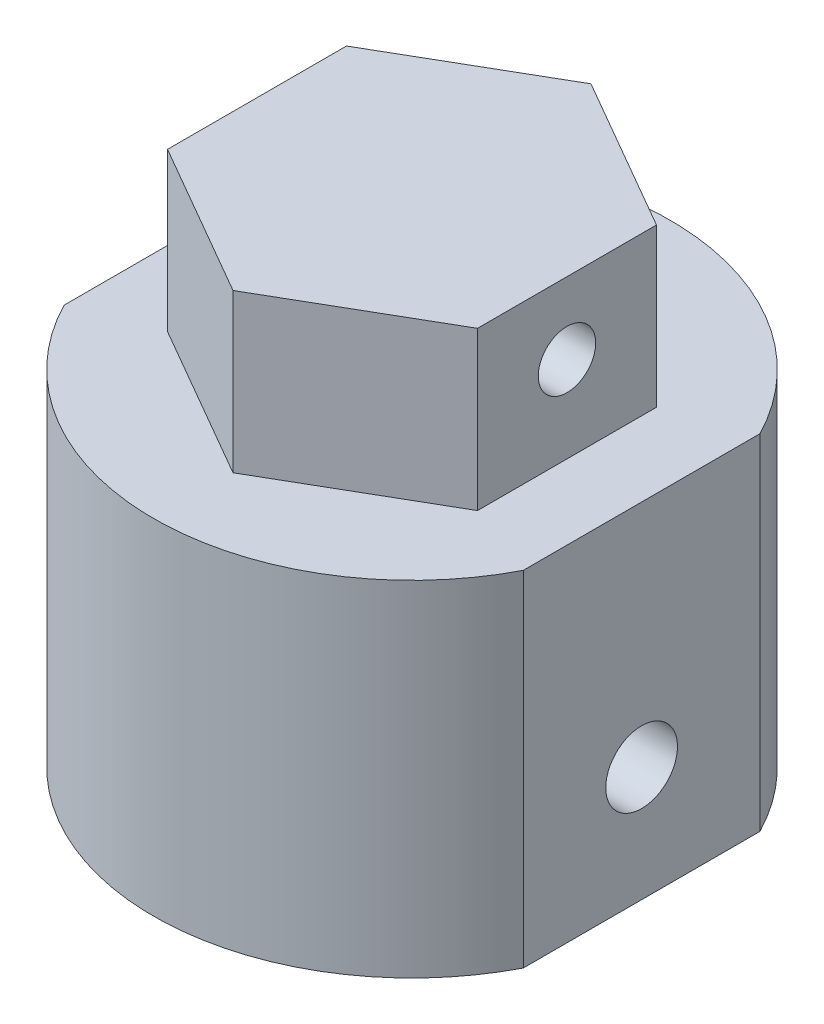
ISO-10303-21;
HEADER;
FILE_DESCRIPTION(('STEP AP214'),'2;1');
FILE_NAME('part.step','',(''),(''),'','','');
FILE_SCHEMA(('AUTOMOTIVE_DESIGN { 1 0 10303 214 1 1 1 1 }'));
ENDSEC;
DATA;
#1=APPLICATION_CONTEXT('core data for automotive mechanical design processes');
#2=APPLICATION_PROTOCOL_DEFINITION('international standard','automotive_design',2000,#1);
#3=PRODUCT_CONTEXT('',#1,'mechanical');
#4=PRODUCT('Part','Part','',(#3));
#5=PRODUCT_RELATED_PRODUCT_CATEGORY('part','',(#4));
#6=PRODUCT_DEFINITION_FORMATION('','',#4);
#7=PRODUCT_DEFINITION_CONTEXT('part definition',#1,'design');
#8=PRODUCT_DEFINITION('design','',#6,#7);
#9=PRODUCT_DEFINITION_SHAPE('','',#8);
#10=(LENGTH_UNIT() NAMED_UNIT(*) SI_UNIT(.MILLI.,.METRE.));
#11=(NAMED_UNIT(*) PLANE_ANGLE_UNIT() SI_UNIT($,.RADIAN.));
#12=(NAMED_UNIT(*) SI_UNIT($,.STERADIAN.) SOLID_ANGLE_UNIT());
#13=UNCERTAINTY_MEASURE_WITH_UNIT(LENGTH_MEASURE(1.E-05),#10,'distance_accuracy_value','');
#14=(GEOMETRIC_REPRESENTATION_CONTEXT(3) GLOBAL_UNCERTAINTY_ASSIGNED_CONTEXT((#13)) GLOBAL_UNIT_ASSIGNED_CONTEXT((#10,
#11,#12)) REPRESENTATION_CONTEXT('',''));
#15=CARTESIAN_POINT('',(0.,0.,0.));
#16=DIRECTION('',(0.,0.,1.));
#17=DIRECTION('',(1.,0.,0.));
#18=AXIS2_PLACEMENT_3D('',#15,#16,#17);
#19=CARTESIAN_POINT('',(0.,12.,0.));
#20=DIRECTION('',(0.,-1.,0.));
#21=DIRECTION('',(0.,0.,-1.));
#22=AXIS2_PLACEMENT_3D('',#19,#20,#21);
#23=CYLINDRICAL_SURFACE('',#22,9.);
#24=CARTESIAN_POINT('',(0.,12.,0.));
#25=DIRECTION('',(0.,1.,0.));
#26=DIRECTION('',(0.,0.,1.));
#27=AXIS2_PLACEMENT_3D('',#24,#25,#26);
#28=CIRCLE('',#27,9.);
#29=CARTESIAN_POINT('',(-8.00000000000001,12.,4.12310562561763));
#30=VERTEX_POINT('',#29);
#31=CARTESIAN_POINT('',(8.00000000000001,12.,4.12310562561763));
#32=VERTEX_POINT('',#31);
#33=EDGE_CURVE('E52',#30,#32,#28,.T.);
#34=ORIENTED_EDGE('',*,*,#33,.F.);
#35=DIRECTION('',(0.,-1.,0.));
#36=VECTOR('',#35,1.);
#37=CARTESIAN_POINT('',(-8.00000000000001,17.501,4.12310562561763));
#38=LINE('',#37,#36);
#39=CARTESIAN_POINT('',(-8.00000000000001,0.,4.12310562561763));
#40=VERTEX_POINT('',#39);
#41=EDGE_CURVE('E123',#30,#40,#38,.T.);
#42=ORIENTED_EDGE('',*,*,#41,.T.);
#43=CARTESIAN_POINT('',(0.,0.,0.));
#44=DIRECTION('',(0.,1.,0.));
#45=DIRECTION('',(0.,0.,1.));
#46=AXIS2_PLACEMENT_3D('',#43,#44,#45);
#47=CIRCLE('',#46,9.);
#48=CARTESIAN_POINT('',(8.00000000000001,0.,4.12310562561763));
#49=VERTEX_POINT('',#48);
#50=EDGE_CURVE('E236',#40,#49,#47,.T.);
#51=ORIENTED_EDGE('',*,*,#50,.T.);
#52=DIRECTION('',(0.,-1.,0.));
#53=VECTOR('',#52,1.);
#54=CARTESIAN_POINT('',(8.00000000000001,17.501,4.12310562561766));
#55=LINE('',#54,#53);
#56=EDGE_CURVE('E68',#32,#49,#55,.T.);
#57=ORIENTED_EDGE('',*,*,#56,.F.);
#58=EDGE_LOOP('',(#34,#42,#51,#57));
#59=FACE_BOUND('',#58,.T.);
#60=ADVANCED_FACE('F42',(#59),#23,.T.);
#61=CARTESIAN_POINT('',(8.00000000000001,0.,-4.12310562561767));
#62=VERTEX_POINT('',#61);
#63=CARTESIAN_POINT('',(-7.99999999999999,0.,-4.12310562561769));
#64=VERTEX_POINT('',#63);
#65=EDGE_CURVE('E135',#62,#64,#47,.T.);
#66=ORIENTED_EDGE('',*,*,#65,.T.);
#67=DIRECTION('',(0.,-1.,0.));
#68=VECTOR('',#67,1.);
#69=CARTESIAN_POINT('',(-7.99999999999999,17.501,-4.12310562561769));
#70=LINE('',#69,#68);
#71=CARTESIAN_POINT('',(-7.99999999999999,12.,-4.12310562561769));
#72=VERTEX_POINT('',#71);
#73=EDGE_CURVE('E60',#72,#64,#70,.T.);
#74=ORIENTED_EDGE('',*,*,#73,.F.);
#75=CARTESIAN_POINT('',(8.00000000000001,12.,-4.12310562561767));
#76=VERTEX_POINT('',#75);
#77=EDGE_CURVE('E11',#76,#72,#28,.T.);
#78=ORIENTED_EDGE('',*,*,#77,.F.);
#79=DIRECTION('',(0.,-1.,0.));
#80=VECTOR('',#79,1.);
#81=CARTESIAN_POINT('',(8.00000000000001,17.501,-4.12310562561767));
#82=LINE('',#81,#80);
#83=EDGE_CURVE('E144',#76,#62,#82,.T.);
#84=ORIENTED_EDGE('',*,*,#83,.T.);
#85=EDGE_LOOP('',(#66,#74,#78,#84));
#86=FACE_BOUND('',#85,.T.);
#87=ADVANCED_FACE('F44',(#86),#23,.T.);
#88=CARTESIAN_POINT('',(0.,12.,0.));
#89=DIRECTION('',(0.,1.,0.));
#90=DIRECTION('',(0.,0.,1.));
#91=AXIS2_PLACEMENT_3D('',#88,#89,#90);
#92=PLANE('',#91);
#93=DIRECTION('',(0.,0.,1.));
#94=VECTOR('',#93,1.);
#95=CARTESIAN_POINT('',(-7.99999999999999,12.,-4.12310562561769));
#96=LINE('',#95,#94);
#97=EDGE_CURVE('E120',#72,#30,#96,.T.);
#98=ORIENTED_EDGE('',*,*,#97,.T.);
#99=ORIENTED_EDGE('',*,*,#33,.T.);
#100=DIRECTION('',(0.,0.,-1.));
#101=VECTOR('',#100,1.);
#102=CARTESIAN_POINT('',(8.00000000000001,12.,-4.12310562561767));
#103=LINE('',#102,#101);
#104=EDGE_CURVE('E142',#32,#76,#103,.T.);
#105=ORIENTED_EDGE('',*,*,#104,.T.);
#106=ORIENTED_EDGE('',*,*,#77,.T.);
#107=EDGE_LOOP('',(#98,#99,#105,#106));
#108=FACE_BOUND('',#107,.T.);
#109=DIRECTION('',(-0.866025403784439,0.,-0.5));
#110=VECTOR('',#109,1.);
#111=CARTESIAN_POINT('',(5.4,12.,-3.11769145362398));
#112=LINE('',#111,#110);
#113=CARTESIAN_POINT('',(5.4,12.,-3.11769145362398));
#114=VERTEX_POINT('',#113);
#115=CARTESIAN_POINT('',(0.,12.,-6.23538290724796));
#116=VERTEX_POINT('',#115);
#117=EDGE_CURVE('E191',#114,#116,#112,.T.);
#118=ORIENTED_EDGE('',*,*,#117,.F.);
#119=DIRECTION('',(0.,0.,-1.));
#120=VECTOR('',#119,1.);
#121=CARTESIAN_POINT('',(5.4,12.,3.11769145362398));
#122=LINE('',#121,#120);
#123=CARTESIAN_POINT('',(5.4,12.,3.11769145362398));
#124=VERTEX_POINT('',#123);
#125=EDGE_CURVE('E175',#124,#114,#122,.T.);
#126=ORIENTED_EDGE('',*,*,#125,.F.);
#127=DIRECTION('',(0.866025403784439,0.,-0.5));
#128=VECTOR('',#127,1.);
#129=CARTESIAN_POINT('',(0.,12.,6.23538290724796));
#130=LINE('',#129,#128);
#131=CARTESIAN_POINT('',(0.,12.,6.23538290724796));
#132=VERTEX_POINT('',#131);
#133=EDGE_CURVE('E207',#132,#124,#130,.T.);
#134=ORIENTED_EDGE('',*,*,#133,.F.);
#135=DIRECTION('',(0.866025403784439,0.,0.5));
#136=VECTOR('',#135,1.);
#137=CARTESIAN_POINT('',(-5.4,12.,3.11769145362398));
#138=LINE('',#137,#136);
#139=CARTESIAN_POINT('',(-5.4,12.,3.11769145362398));
#140=VERTEX_POINT('',#139);
#141=EDGE_CURVE('E203',#140,#132,#138,.T.);
#142=ORIENTED_EDGE('',*,*,#141,.F.);
#143=DIRECTION('',(0.,0.,1.));
#144=VECTOR('',#143,1.);
#145=CARTESIAN_POINT('',(-5.4,12.,-3.11769145362398));
#146=LINE('',#145,#144);
#147=CARTESIAN_POINT('',(-5.4,12.,-3.11769145362398));
#148=VERTEX_POINT('',#147);
#149=EDGE_CURVE('E199',#148,#140,#146,.T.);
#150=ORIENTED_EDGE('',*,*,#149,.F.);
#151=DIRECTION('',(-0.866025403784439,0.,0.5));
#152=VECTOR('',#151,1.);
#153=CARTESIAN_POINT('',(0.,12.,-6.23538290724796));
#154=LINE('',#153,#152);
#155=EDGE_CURVE('E195',#116,#148,#154,.T.);
#156=ORIENTED_EDGE('',*,*,#155,.F.);
#157=EDGE_LOOP('',(#118,#126,#134,#142,#150,#156));
#158=FACE_BOUND('',#157,.T.);
#159=ADVANCED_FACE('F140',(#108,#158),#92,.T.);
#160=CARTESIAN_POINT('',(0.,0.,0.));
#161=DIRECTION('',(0.,1.,0.));
#162=DIRECTION('',(0.,0.,1.));
#163=AXIS2_PLACEMENT_3D('',#160,#161,#162);
#164=PLANE('',#163);
#165=CARTESIAN_POINT('',(0.,0.,0.));
#166=DIRECTION('',(0.,-1.,0.));
#167=DIRECTION('',(0.,0.,-1.));
#168=AXIS2_PLACEMENT_3D('',#165,#166,#167);
#169=CIRCLE('',#168,3.125);
#170=CARTESIAN_POINT('',(0.,0.,-3.125));
#171=VERTEX_POINT('',#170);
#172=EDGE_CURVE('E128',#171,#171,#169,.T.);
#173=ORIENTED_EDGE('',*,*,#172,.F.);
#174=EDGE_LOOP('',(#173));
#175=FACE_BOUND('',#174,.T.);
#176=ORIENTED_EDGE('',*,*,#50,.F.);
#177=DIRECTION('',(0.,0.,1.));
#178=VECTOR('',#177,1.);
#179=CARTESIAN_POINT('',(-7.99999999999999,0.,-4.12310562561769));
#180=LINE('',#179,#178);
#181=EDGE_CURVE('E137',#64,#40,#180,.T.);
#182=ORIENTED_EDGE('',*,*,#181,.F.);
#183=ORIENTED_EDGE('',*,*,#65,.F.);
#184=DIRECTION('',(0.,0.,-1.));
#185=VECTOR('',#184,1.);
#186=CARTESIAN_POINT('',(8.00000000000001,0.,-4.12310562561767));
#187=LINE('',#186,#185);
#188=EDGE_CURVE('E155',#49,#62,#187,.T.);
#189=ORIENTED_EDGE('',*,*,#188,.F.);
#190=EDGE_LOOP('',(#176,#182,#183,#189));
#191=FACE_BOUND('',#190,.T.);
#192=ADVANCED_FACE('F244',(#175,#191),#164,.F.);
#193=CARTESIAN_POINT('',(5.4,17.5,-3.11769145362398));
#194=DIRECTION('',(-0.5,0.,0.866025403784439));
#195=DIRECTION('',(0.866025403784439,0.,0.5));
#196=AXIS2_PLACEMENT_3D('',#193,#194,#195);
#197=PLANE('',#196);
#198=ORIENTED_EDGE('',*,*,#117,.T.);
#199=DIRECTION('',(0.,-1.,0.));
#200=VECTOR('',#199,1.);
#201=CARTESIAN_POINT('',(0.,17.5,-6.23538290724796));
#202=LINE('',#201,#200);
#203=CARTESIAN_POINT('',(0.,17.5,-6.23538290724796));
#204=VERTEX_POINT('',#203);
#205=EDGE_CURVE('E233',#204,#116,#202,.T.);
#206=ORIENTED_EDGE('',*,*,#205,.F.);
#207=DIRECTION('',(-0.866025403784439,0.,-0.5));
#208=VECTOR('',#207,1.);
#209=CARTESIAN_POINT('',(5.4,17.5,-3.11769145362398));
#210=LINE('',#209,#208);
#211=CARTESIAN_POINT('',(5.4,17.5,-3.11769145362398));
#212=VERTEX_POINT('',#211);
#213=EDGE_CURVE('E170',#212,#204,#210,.T.);
#214=ORIENTED_EDGE('',*,*,#213,.F.);
#215=DIRECTION('',(0.,-1.,0.));
#216=VECTOR('',#215,1.);
#217=CARTESIAN_POINT('',(5.4,17.5,-3.11769145362398));
#218=LINE('',#217,#216);
#219=EDGE_CURVE('E190',#212,#114,#218,.T.);
#220=ORIENTED_EDGE('',*,*,#219,.T.);
#221=EDGE_LOOP('',(#198,#206,#214,#220));
#222=FACE_BOUND('',#221,.T.);
#223=ADVANCED_FACE('F273',(#222),#197,.F.);
#224=CARTESIAN_POINT('',(0.,17.5,-6.23538290724796));
#225=DIRECTION('',(0.5,0.,0.866025403784439));
#226=DIRECTION('',(0.866025403784439,0.,-0.5));
#227=AXIS2_PLACEMENT_3D('',#224,#225,#226);
#228=PLANE('',#227);
#229=ORIENTED_EDGE('',*,*,#155,.T.);
#230=DIRECTION('',(0.,-1.,0.));
#231=VECTOR('',#230,1.);
#232=CARTESIAN_POINT('',(-5.4,17.5,-3.11769145362398));
#233=LINE('',#232,#231);
#234=CARTESIAN_POINT('',(-5.4,17.5,-3.11769145362398));
#235=VERTEX_POINT('',#234);
#236=EDGE_CURVE('E229',#235,#148,#233,.T.);
#237=ORIENTED_EDGE('',*,*,#236,.F.);
#238=DIRECTION('',(-0.866025403784439,0.,0.5));
#239=VECTOR('',#238,1.);
#240=CARTESIAN_POINT('',(0.,17.5,-6.23538290724796));
#241=LINE('',#240,#239);
#242=EDGE_CURVE('E174',#204,#235,#241,.T.);
#243=ORIENTED_EDGE('',*,*,#242,.F.);
#244=ORIENTED_EDGE('',*,*,#205,.T.);
#245=EDGE_LOOP('',(#229,#237,#243,#244));
#246=FACE_BOUND('',#245,.T.);
#247=ADVANCED_FACE('F278',(#246),#228,.F.);
#248=CARTESIAN_POINT('',(-5.4,17.5,-3.11769145362398));
#249=DIRECTION('',(1.,0.,0.));
#250=DIRECTION('',(0.,0.,-1.));
#251=AXIS2_PLACEMENT_3D('',#248,#249,#250);
#252=PLANE('',#251);
#253=CARTESIAN_POINT('',(-5.4,15.,0.));
#254=DIRECTION('',(-1.,0.,0.));
#255=DIRECTION('',(0.,0.,1.));
#256=AXIS2_PLACEMENT_3D('',#253,#254,#255);
#257=CIRCLE('',#256,1.);
#258=CARTESIAN_POINT('',(-5.4,15.,1.));
#259=VERTEX_POINT('',#258);
#260=EDGE_CURVE('E163',#259,#259,#257,.T.);
#261=ORIENTED_EDGE('',*,*,#260,.F.);
#262=EDGE_LOOP('',(#261));
#263=FACE_BOUND('',#262,.T.);
#264=ORIENTED_EDGE('',*,*,#149,.T.);
#265=DIRECTION('',(0.,-1.,0.));
#266=VECTOR('',#265,1.);
#267=CARTESIAN_POINT('',(-5.4,17.5,3.11769145362398));
#268=LINE('',#267,#266);
#269=CARTESIAN_POINT('',(-5.4,17.5,3.11769145362398));
#270=VERTEX_POINT('',#269);
#271=EDGE_CURVE('E225',#270,#140,#268,.T.);
#272=ORIENTED_EDGE('',*,*,#271,.F.);
#273=DIRECTION('',(0.,0.,1.));
#274=VECTOR('',#273,1.);
#275=CARTESIAN_POINT('',(-5.4,17.5,-3.11769145362398));
#276=LINE('',#275,#274);
#277=EDGE_CURVE('E178',#235,#270,#276,.T.);
#278=ORIENTED_EDGE('',*,*,#277,.F.);
#279=ORIENTED_EDGE('',*,*,#236,.T.);
#280=EDGE_LOOP('',(#264,#272,#278,#279));
#281=FACE_BOUND('',#280,.T.);
#282=ADVANCED_FACE('F282',(#263,#281),#252,.F.);
#283=CARTESIAN_POINT('',(-5.4,17.5,3.11769145362398));
#284=DIRECTION('',(0.5,0.,-0.866025403784439));
#285=DIRECTION('',(-0.866025403784439,0.,-0.5));
#286=AXIS2_PLACEMENT_3D('',#283,#284,#285);
#287=PLANE('',#286);
#288=ORIENTED_EDGE('',*,*,#141,.T.);
#289=DIRECTION('',(0.,-1.,0.));
#290=VECTOR('',#289,1.);
#291=CARTESIAN_POINT('',(0.,17.5,6.23538290724796));
#292=LINE('',#291,#290);
#293=CARTESIAN_POINT('',(0.,17.5,6.23538290724796));
#294=VERTEX_POINT('',#293);
#295=EDGE_CURVE('E221',#294,#132,#292,.T.);
#296=ORIENTED_EDGE('',*,*,#295,.F.);
#297=DIRECTION('',(0.866025403784439,0.,0.5));
#298=VECTOR('',#297,1.);
#299=CARTESIAN_POINT('',(-5.4,17.5,3.11769145362398));
#300=LINE('',#299,#298);
#301=EDGE_CURVE('E181',#270,#294,#300,.T.);
#302=ORIENTED_EDGE('',*,*,#301,.F.);
#303=ORIENTED_EDGE('',*,*,#271,.T.);
#304=EDGE_LOOP('',(#288,#296,#302,#303));
#305=FACE_BOUND('',#304,.T.);
#306=ADVANCED_FACE('F286',(#305),#287,.F.);
#307=CARTESIAN_POINT('',(0.,17.5,6.23538290724796));
#308=DIRECTION('',(-0.5,0.,-0.866025403784439));
#309=DIRECTION('',(-0.866025403784439,0.,0.5));
#310=AXIS2_PLACEMENT_3D('',#307,#308,#309);
#311=PLANE('',#310);
#312=ORIENTED_EDGE('',*,*,#133,.T.);
#313=DIRECTION('',(0.,-1.,0.));
#314=VECTOR('',#313,1.);
#315=CARTESIAN_POINT('',(5.4,17.5,3.11769145362398));
#316=LINE('',#315,#314);
#317=CARTESIAN_POINT('',(5.4,17.5,3.11769145362398));
#318=VERTEX_POINT('',#317);
#319=EDGE_CURVE('E217',#318,#124,#316,.T.);
#320=ORIENTED_EDGE('',*,*,#319,.F.);
#321=DIRECTION('',(0.866025403784439,0.,-0.5));
#322=VECTOR('',#321,1.);
#323=CARTESIAN_POINT('',(0.,17.5,6.23538290724796));
#324=LINE('',#323,#322);
#325=EDGE_CURVE('E184',#294,#318,#324,.T.);
#326=ORIENTED_EDGE('',*,*,#325,.F.);
#327=ORIENTED_EDGE('',*,*,#295,.T.);
#328=EDGE_LOOP('',(#312,#320,#326,#327));
#329=FACE_BOUND('',#328,.T.);
#330=ADVANCED_FACE('F290',(#329),#311,.F.);
#331=CARTESIAN_POINT('',(5.4,17.5,3.11769145362398));
#332=DIRECTION('',(-1.,0.,0.));
#333=DIRECTION('',(0.,0.,1.));
#334=AXIS2_PLACEMENT_3D('',#331,#332,#333);
#335=PLANE('',#334);
#336=CARTESIAN_POINT('',(5.4,15.,0.));
#337=DIRECTION('',(-1.,0.,0.));
#338=DIRECTION('',(0.,0.,1.));
#339=AXIS2_PLACEMENT_3D('',#336,#337,#338);
#340=CIRCLE('',#339,1.);
#341=CARTESIAN_POINT('',(5.4,15.,1.));
#342=VERTEX_POINT('',#341);
#343=EDGE_CURVE('E46',#342,#342,#340,.T.);
#344=ORIENTED_EDGE('',*,*,#343,.T.);
#345=EDGE_LOOP('',(#344));
#346=FACE_BOUND('',#345,.T.);
#347=ORIENTED_EDGE('',*,*,#125,.T.);
#348=ORIENTED_EDGE('',*,*,#219,.F.);
#349=DIRECTION('',(0.,0.,-1.));
#350=VECTOR('',#349,1.);
#351=CARTESIAN_POINT('',(5.4,17.5,3.11769145362398));
#352=LINE('',#351,#350);
#353=EDGE_CURVE('E187',#318,#212,#352,.T.);
#354=ORIENTED_EDGE('',*,*,#353,.F.);
#355=ORIENTED_EDGE('',*,*,#319,.T.);
#356=EDGE_LOOP('',(#347,#348,#354,#355));
#357=FACE_BOUND('',#356,.T.);
#358=ADVANCED_FACE('F294',(#346,#357),#335,.F.);
#359=CARTESIAN_POINT('',(0.,17.5,0.));
#360=DIRECTION('',(0.,1.,0.));
#361=DIRECTION('',(0.,0.,1.));
#362=AXIS2_PLACEMENT_3D('',#359,#360,#361);
#363=PLANE('',#362);
#364=ORIENTED_EDGE('',*,*,#213,.T.);
#365=ORIENTED_EDGE('',*,*,#242,.T.);
#366=ORIENTED_EDGE('',*,*,#277,.T.);
#367=ORIENTED_EDGE('',*,*,#301,.T.);
#368=ORIENTED_EDGE('',*,*,#325,.T.);
#369=ORIENTED_EDGE('',*,*,#353,.T.);
#370=EDGE_LOOP('',(#364,#365,#366,#367,#368,#369));
#371=FACE_BOUND('',#370,.T.);
#372=ADVANCED_FACE('F298',(#371),#363,.T.);
#373=CARTESIAN_POINT('',(9.,15.,0.));
#374=DIRECTION('',(-1.,0.,0.));
#375=DIRECTION('',(0.,0.,1.));
#376=AXIS2_PLACEMENT_3D('',#373,#374,#375);
#377=CYLINDRICAL_SURFACE('',#376,1.);
#378=ORIENTED_EDGE('',*,*,#260,.T.);
#379=EDGE_LOOP('',(#378));
#380=FACE_BOUND('',#379,.T.);
#381=ORIENTED_EDGE('',*,*,#343,.F.);
#382=EDGE_LOOP('',(#381));
#383=FACE_BOUND('',#382,.T.);
#384=ADVANCED_FACE('F302',(#380,#383),#377,.F.);
#385=CARTESIAN_POINT('',(0.,12.,0.));
#386=DIRECTION('',(0.,-1.,0.));
#387=DIRECTION('',(0.,0.,-1.));
#388=AXIS2_PLACEMENT_3D('',#385,#386,#387);
#389=CYLINDRICAL_SURFACE('',#388,3.125);
#390=CARTESIAN_POINT('',(2.8641098093474,4.,1.25000000000001));
#391=CARTESIAN_POINT('',(2.86411657285263,3.93303781368757,1.24999265887737));
#392=CARTESIAN_POINT('',(2.86649126552666,3.86598091580956,1.24458738662148));
#393=CARTESIAN_POINT('',(2.87569321367403,3.73379072945183,1.22316814412046));
#394=CARTESIAN_POINT('',(2.88253184616782,3.6686628018247,1.20712706527634));
#395=CARTESIAN_POINT('',(2.8997528486956,3.54246691126872,1.16514689535545));
#396=CARTESIAN_POINT('',(2.91012185223197,3.48138465789984,1.1392450953284));
#397=CARTESIAN_POINT('',(2.9332166568455,3.36444684321274,1.07838766835726));
#398=CARTESIAN_POINT('',(2.94594194314952,3.30859014428071,1.04343401829219));
#399=CARTESIAN_POINT('',(2.97313040656895,3.20046224859909,0.963326234117143));
#400=CARTESIAN_POINT('',(2.98764948724216,3.14852723566908,0.917737098579586));
#401=CARTESIAN_POINT('',(3.01632785611757,3.05279437667789,0.818568191108784));
#402=CARTESIAN_POINT('',(3.03048701710232,3.00899937419384,0.764985638547307));
#403=CARTESIAN_POINT('',(3.05752129941784,2.92912100188581,0.648753943972743));
#404=CARTESIAN_POINT('',(3.0703237730223,2.89340981158085,0.585830603507682));
#405=CARTESIAN_POINT('',(3.09252454769717,2.83322276975637,0.454265826796956));
#406=CARTESIAN_POINT('',(3.10192423365421,2.80874234638628,0.385626730804983));
#407=CARTESIAN_POINT('',(3.11586453130178,2.77291157097663,0.248104016774314));
#408=CARTESIAN_POINT('',(3.12061835484598,2.76098292869436,0.179393115502885));
#409=CARTESIAN_POINT('',(3.12550194176689,2.74873219646082,0.0407914553985389));
#410=CARTESIAN_POINT('',(3.12563342980821,2.74840577754072,-0.0290988536408698));
#411=CARTESIAN_POINT('',(3.12138726763616,2.75905173110937,-0.163895309197063));
#412=CARTESIAN_POINT('',(3.11726247982398,2.76939048296683,-0.228860908046264));
#413=CARTESIAN_POINT('',(3.10530807167994,2.79999554769422,-0.356045693261454));
#414=CARTESIAN_POINT('',(3.09747817950695,2.82026258900024,-0.418264677743842));
#415=CARTESIAN_POINT('',(3.07873015286062,2.87039780179769,-0.539311211569778));
#416=CARTESIAN_POINT('',(3.0677672529175,2.90040607175971,-0.598073514612264));
#417=CARTESIAN_POINT('',(3.04384115737311,2.96904062932438,-0.709880094212852));
#418=CARTESIAN_POINT('',(3.03087727665671,3.00766987068601,-0.762922401697561));
#419=CARTESIAN_POINT('',(3.00326023236459,3.09540570996662,-0.865480517495088));
#420=CARTESIAN_POINT('',(2.9885520407515,3.1450336828649,-0.91453615329602));
#421=CARTESIAN_POINT('',(2.95976038102987,3.2518691073881,-1.00381713461582));
#422=CARTESIAN_POINT('',(2.94567711860217,3.30907903009635,-1.04403958984978));
#423=CARTESIAN_POINT('',(2.91935560901133,3.4315118890056,-1.11556511796433));
#424=CARTESIAN_POINT('',(2.90718071363363,3.49691551905239,-1.14658415733431));
#425=CARTESIAN_POINT('',(2.88679744042078,3.63263468153876,-1.19698516247891));
#426=CARTESIAN_POINT('',(2.87858648702087,3.70294699048178,-1.21637468650274));
#427=CARTESIAN_POINT('',(2.86768599795353,3.84189736089753,-1.24184684301997));
#428=CARTESIAN_POINT('',(2.86468979030048,3.9103752794501,-1.24867006050525));
#429=CARTESIAN_POINT('',(2.86368436173187,4.04754825485497,-1.25097582903063));
#430=CARTESIAN_POINT('',(2.8656736285154,4.11624323954865,-1.24646181912055));
#431=CARTESIAN_POINT('',(2.87410027723208,4.2477868343468,-1.22689555924282));
#432=CARTESIAN_POINT('',(2.88027786123606,4.31074558587469,-1.21245816376465));
#433=CARTESIAN_POINT('',(2.8960628189242,4.43330525299126,-1.17425261681954));
#434=CARTESIAN_POINT('',(2.90567095305465,4.49290542069207,-1.15048239643899));
#435=CARTESIAN_POINT('',(2.92771113662469,4.60975147362218,-1.0932097746759));
#436=CARTESIAN_POINT('',(2.9402419039946,4.66680386793404,-1.05935179266536));
#437=CARTESIAN_POINT('',(2.96656490723649,4.77467686715104,-0.983228265276165));
#438=CARTESIAN_POINT('',(2.98035765560039,4.82549492049725,-0.940959295926232));
#439=CARTESIAN_POINT('',(3.00888072482123,4.92335838037451,-0.845527632300295));
#440=CARTESIAN_POINT('',(3.02360504553252,4.96984785330689,-0.79179089340318));
#441=CARTESIAN_POINT('',(3.05137371604727,5.05323567288146,-0.676927270855521));
#442=CARTESIAN_POINT('',(3.06441799745775,5.09013362912327,-0.615800086542408));
#443=CARTESIAN_POINT('',(3.08739822437679,5.15315476653827,-0.487674958751093));
#444=CARTESIAN_POINT('',(3.09733491400171,5.17928052760362,-0.420678425621283));
#445=CARTESIAN_POINT('',(3.11295445918306,5.21971803275477,-0.282745994324508));
#446=CARTESIAN_POINT('',(3.11863962317215,5.23403618840004,-0.211812256433911));
#447=CARTESIAN_POINT('',(3.1248688013157,5.24969043851587,-0.0730103189664318));
#448=CARTESIAN_POINT('',(3.12572404215546,5.25181258028916,-0.00524405787065191));
#449=CARTESIAN_POINT('',(3.1230377648662,5.24509032544743,0.129646147333285));
#450=CARTESIAN_POINT('',(3.1194969122932,5.23624758888399,0.196770187121646));
#451=CARTESIAN_POINT('',(3.10857195852659,5.20840825727595,0.326356813716514));
#452=CARTESIAN_POINT('',(3.10130925396457,5.18973190870278,0.388899252905248));
#453=CARTESIAN_POINT('',(3.08371842395023,5.14309199714886,0.509951471724345));
#454=CARTESIAN_POINT('',(3.07338973315007,5.11512672123728,0.568460505167055));
#455=CARTESIAN_POINT('',(3.05011308975036,5.04931050094416,0.682626901160079));
#456=CARTESIAN_POINT('',(3.03706956080144,5.01107731569682,0.738043991754023));
#457=CARTESIAN_POINT('',(3.00993376991529,4.92638217551317,0.841908767827552));
#458=CARTESIAN_POINT('',(2.99584107531563,4.87991681471243,0.890353553591104));
#459=CARTESIAN_POINT('',(2.96711102224639,4.77667798467184,0.982000790678752));
#460=CARTESIAN_POINT('',(2.95249395378364,4.71944445412431,1.0246930544994));
#461=CARTESIAN_POINT('',(2.92531044671987,4.59816116410702,1.09990465652463));
#462=CARTESIAN_POINT('',(2.91274424929659,4.53411060443134,1.1324227986875));
#463=CARTESIAN_POINT('',(2.89224290286192,4.40685174884495,1.18374442979583));
#464=CARTESIAN_POINT('',(2.8839932413228,4.34408422828051,1.20351719635264));
#465=CARTESIAN_POINT('',(2.87153752252477,4.21594661273104,1.2329485986365));
#466=CARTESIAN_POINT('',(2.86732020045109,4.15058430252065,1.24263541743002));
#467=CARTESIAN_POINT('',(2.86452786723521,4.05663902353879,1.24904016144386));
#468=CARTESIAN_POINT('',(2.86410694808348,4.0283279868765,1.25000310562181));
#469=CARTESIAN_POINT('',(2.8641098093474,4.,1.25000000000001));
#470=B_SPLINE_CURVE_WITH_KNOTS('',3,(#390,#391,#392,#393,#394,#395,#396,#397,#398,#399,#400,
#401,#402,#403,#404,#405,#406,#407,#408,#409,#410,#411,#412,#413,#414,#415,#416,#417,#418,#419,
#420,#421,#422,#423,#424,#425,#426,#427,#428,#429,#430,#431,#432,#433,#434,#435,#436,#437,#438,
#439,#440,#441,#442,#443,#444,#445,#446,#447,#448,#449,#450,#451,#452,#453,#454,#455,#456,#457,
#458,#459,#460,#461,#462,#463,#464,#465,#466,#467,#468,#469),.UNSPECIFIED.,.T.,.F.,(4,2,2,2,2,2,
2,2,2,2,2,2,2,2,2,2,2,2,2,2,2,2,2,2,2,2,2,2,2,2,2,2,2,2,2,2,2,2,2,4),(0.,0.200798530479784,
0.402110834888904,0.602669264558369,0.803183930149135,1.01409761427765,1.22508483967714,
1.44439168182143,1.66360916855925,1.8722136430449,2.08074028316045,2.27755403018939,
2.47438221955662,2.67417687646811,2.87404009337519,3.08702527550847,3.30008004454454,
3.5191528669661,3.7380831549632,3.94363842199019,4.14913134313718,4.34292030049472,
4.5367522415353,4.73844471654194,4.94021946574912,5.15689833900618,5.37358603029224,
5.59022179566764,5.80673984967591,6.00913149843727,6.21149250941632,6.40763746523351,
6.60381861139122,6.80866906958709,7.01360447848885,7.23122658299765,7.44887426095749,
7.64697913008179,7.84452893883284,7.92947565950458),.UNSPECIFIED.);
#471=CARTESIAN_POINT('',(2.8641098093474,4.,1.25000000000001));
#472=VERTEX_POINT('',#471);
#473=EDGE_CURVE('E145',#472,#472,#470,.T.);
#474=ORIENTED_EDGE('',*,*,#473,.T.);
#475=EDGE_LOOP('',(#474));
#476=FACE_BOUND('',#475,.T.);
#477=CARTESIAN_POINT('',(-2.8641098093474,4.,1.24999999999999));
#478=CARTESIAN_POINT('',(-2.86411657285264,4.06696218631243,1.24999265887736));
#479=CARTESIAN_POINT('',(-2.86649126552666,4.13401908419044,1.24458738662146));
#480=CARTESIAN_POINT('',(-2.87569321367404,4.26620927054817,1.22316814412045));
#481=CARTESIAN_POINT('',(-2.88253184616783,4.33133719817531,1.20712706527632));
#482=CARTESIAN_POINT('',(-2.89975284869561,4.45753308873128,1.16514689535543));
#483=CARTESIAN_POINT('',(-2.91012185223197,4.51861534210016,1.13924509532838));
#484=CARTESIAN_POINT('',(-2.93321665684551,4.63555315678726,1.07838766835725));
#485=CARTESIAN_POINT('',(-2.94594194314952,4.69140985571929,1.04343401829218));
#486=CARTESIAN_POINT('',(-2.97313040656896,4.79953775140091,0.963326234117125));
#487=CARTESIAN_POINT('',(-2.98764948724217,4.85147276433092,0.917737098579568));
#488=CARTESIAN_POINT('',(-3.01632785611757,4.94720562332211,0.818568191108766));
#489=CARTESIAN_POINT('',(-3.03048701710233,4.99100062580616,0.764985638547289));
#490=CARTESIAN_POINT('',(-3.05752129941784,5.07087899811419,0.648753943972724));
#491=CARTESIAN_POINT('',(-3.0703237730223,5.10659018841915,0.585830603507664));
#492=CARTESIAN_POINT('',(-3.09252454769717,5.16677723024363,0.454265826796938));
#493=CARTESIAN_POINT('',(-3.10192423365421,5.19125765361372,0.385626730804964));
#494=CARTESIAN_POINT('',(-3.11586453130178,5.22708842902338,0.248104016774295));
#495=CARTESIAN_POINT('',(-3.12061835484598,5.23901707130564,0.179393115502866));
#496=CARTESIAN_POINT('',(-3.12550194176689,5.25126780353918,0.0407914553985199));
#497=CARTESIAN_POINT('',(-3.12563342980821,5.25159422245928,-0.0290988536408888));
#498=CARTESIAN_POINT('',(-3.12138726763616,5.24094826889063,-0.163895309197082));
#499=CARTESIAN_POINT('',(-3.11726247982397,5.23060951703317,-0.228860908046283));
#500=CARTESIAN_POINT('',(-3.10530807167994,5.20000445230578,-0.356045693261473));
#501=CARTESIAN_POINT('',(-3.09747817950695,5.17973741099976,-0.418264677743861));
#502=CARTESIAN_POINT('',(-3.07873015286062,5.12960219820231,-0.539311211569797));
#503=CARTESIAN_POINT('',(-3.0677672529175,5.09959392824029,-0.598073514612283));
#504=CARTESIAN_POINT('',(-3.04384115737311,5.03095937067562,-0.709880094212871));
#505=CARTESIAN_POINT('',(-3.03087727665671,4.99233012931399,-0.76292240169758));
#506=CARTESIAN_POINT('',(-3.00326023236458,4.90459429003338,-0.865480517495106));
#507=CARTESIAN_POINT('',(-2.9885520407515,4.8549663171351,-0.914536153296038));
#508=CARTESIAN_POINT('',(-2.95976038102986,4.7481308926119,-1.00381713461584));
#509=CARTESIAN_POINT('',(-2.94567711860216,4.69092096990365,-1.0440395898498));
#510=CARTESIAN_POINT('',(-2.91935560901132,4.56848811099441,-1.11556511796434));
#511=CARTESIAN_POINT('',(-2.90718071363363,4.50308448094761,-1.14658415733433));
#512=CARTESIAN_POINT('',(-2.88679744042077,4.36736531846124,-1.19698516247893));
#513=CARTESIAN_POINT('',(-2.87858648702087,4.29705300951822,-1.21637468650276));
#514=CARTESIAN_POINT('',(-2.86768599795352,4.15810263910247,-1.24184684301998));
#515=CARTESIAN_POINT('',(-2.86468979030047,4.0896247205499,-1.24867006050527));
#516=CARTESIAN_POINT('',(-2.86368436173186,3.95245174514503,-1.25097582903065));
#517=CARTESIAN_POINT('',(-2.86567362851539,3.88375676045135,-1.24646181912056));
#518=CARTESIAN_POINT('',(-2.87410027723207,3.7522131656532,-1.22689555924284));
#519=CARTESIAN_POINT('',(-2.88027786123606,3.68925441412531,-1.21245816376467));
#520=CARTESIAN_POINT('',(-2.89606281892419,3.56669474700874,-1.17425261681956));
#521=CARTESIAN_POINT('',(-2.90567095305464,3.50709457930793,-1.15048239643901));
#522=CARTESIAN_POINT('',(-2.92771113662468,3.39024852637782,-1.09320977467592));
#523=CARTESIAN_POINT('',(-2.94024190399459,3.33319613206596,-1.05935179266538));
#524=CARTESIAN_POINT('',(-2.96656490723648,3.22532313284896,-0.983228265276183));
#525=CARTESIAN_POINT('',(-2.98035765560039,3.17450507950275,-0.94095929592625));
#526=CARTESIAN_POINT('',(-3.00888072482123,3.07664161962549,-0.845527632300313));
#527=CARTESIAN_POINT('',(-3.02360504553251,3.03015214669311,-0.791790893403197));
#528=CARTESIAN_POINT('',(-3.05137371604727,2.94676432711854,-0.676927270855538));
#529=CARTESIAN_POINT('',(-3.06441799745775,2.90986637087673,-0.615800086542426));
#530=CARTESIAN_POINT('',(-3.08739822437678,2.84684523346173,-0.487674958751112));
#531=CARTESIAN_POINT('',(-3.09733491400171,2.82071947239638,-0.420678425621302));
#532=CARTESIAN_POINT('',(-3.11295445918306,2.78028196724523,-0.282745994324527));
#533=CARTESIAN_POINT('',(-3.11863962317215,2.76596381159996,-0.21181225643393));
#534=CARTESIAN_POINT('',(-3.1248688013157,2.75030956148413,-0.0730103189664514));
#535=CARTESIAN_POINT('',(-3.12572404215546,2.74818741971084,-0.00524405787067165));
#536=CARTESIAN_POINT('',(-3.1230377648662,2.75490967455257,0.129646147333265));
#537=CARTESIAN_POINT('',(-3.1194969122932,2.76375241111601,0.196770187121627));
#538=CARTESIAN_POINT('',(-3.10857195852659,2.79159174272405,0.326356813716495));
#539=CARTESIAN_POINT('',(-3.10130925396457,2.81026809129722,0.388899252905229));
#540=CARTESIAN_POINT('',(-3.08371842395023,2.85690800285114,0.509951471724327));
#541=CARTESIAN_POINT('',(-3.07338973315008,2.88487327876272,0.568460505167036));
#542=CARTESIAN_POINT('',(-3.05011308975036,2.95068949905584,0.682626901160061));
#543=CARTESIAN_POINT('',(-3.03706956080144,2.98892268430318,0.738043991754005));
#544=CARTESIAN_POINT('',(-3.0099337699153,3.07361782448683,0.841908767827534));
#545=CARTESIAN_POINT('',(-2.99584107531563,3.12008318528757,0.890353553591086));
#546=CARTESIAN_POINT('',(-2.96711102224639,3.22332201532816,0.982000790678733));
#547=CARTESIAN_POINT('',(-2.95249395378365,3.28055554587569,1.02469305449938));
#548=CARTESIAN_POINT('',(-2.92531044671988,3.40183883589298,1.09990465652461));
#549=CARTESIAN_POINT('',(-2.9127442492966,3.46588939556866,1.13242279868748));
#550=CARTESIAN_POINT('',(-2.89224290286193,3.59314825115504,1.18374442979581));
#551=CARTESIAN_POINT('',(-2.88399324132281,3.65591577171949,1.20351719635262));
#552=CARTESIAN_POINT('',(-2.87153752252478,3.78405338726896,1.23294859863648));
#553=CARTESIAN_POINT('',(-2.8673202004511,3.84941569747935,1.24263541743));
#554=CARTESIAN_POINT('',(-2.86452786723522,3.94336097646121,1.24904016144385));
#555=CARTESIAN_POINT('',(-2.86410694808349,3.9716720131235,1.25000310562179));
#556=CARTESIAN_POINT('',(-2.8641098093474,4.,1.24999999999999));
#557=B_SPLINE_CURVE_WITH_KNOTS('',3,(#477,#478,#479,#480,#481,#482,#483,#484,#485,#486,#487,
#488,#489,#490,#491,#492,#493,#494,#495,#496,#497,#498,#499,#500,#501,#502,#503,#504,#505,#506,
#507,#508,#509,#510,#511,#512,#513,#514,#515,#516,#517,#518,#519,#520,#521,#522,#523,#524,#525,
#526,#527,#528,#529,#530,#531,#532,#533,#534,#535,#536,#537,#538,#539,#540,#541,#542,#543,#544,
#545,#546,#547,#548,#549,#550,#551,#552,#553,#554,#555,#556),.UNSPECIFIED.,.T.,.F.,(4,2,2,2,2,2,
2,2,2,2,2,2,2,2,2,2,2,2,2,2,2,2,2,2,2,2,2,2,2,2,2,2,2,2,2,2,2,2,2,4),(0.,0.200798530479784,
0.402110834888904,0.602669264558368,0.803183930149135,1.01409761427765,1.22508483967714,
1.44439168182143,1.66360916855925,1.8722136430449,2.08074028316045,2.27755403018939,
2.47438221955662,2.67417687646811,2.8740400933752,3.08702527550847,3.30008004454454,
3.5191528669661,3.7380831549632,3.94363842199019,4.14913134313718,4.34292030049472,
4.5367522415353,4.73844471654194,4.94021946574912,5.15689833900618,5.37358603029224,
5.59022179566764,5.80673984967591,6.00913149843727,6.21149250941632,6.40763746523351,
6.60381861139122,6.80866906958709,7.01360447848885,7.23122658299764,7.44887426095749,
7.64697913008179,7.84452893883284,7.92947565950458),.UNSPECIFIED.);
#558=CARTESIAN_POINT('',(-2.8641098093474,4.,1.24999999999999));
#559=VERTEX_POINT('',#558);
#560=EDGE_CURVE('E151',#559,#559,#557,.T.);
#561=ORIENTED_EDGE('',*,*,#560,.T.);
#562=EDGE_LOOP('',(#561));
#563=FACE_BOUND('',#562,.T.);
#564=CARTESIAN_POINT('',(0.,12.,0.));
#565=DIRECTION('',(0.,-1.,0.));
#566=DIRECTION('',(0.,0.,-1.));
#567=AXIS2_PLACEMENT_3D('',#564,#565,#566);
#568=CIRCLE('',#567,3.125);
#569=CARTESIAN_POINT('',(0.,12.,-3.125));
#570=VERTEX_POINT('',#569);
#571=EDGE_CURVE('E159',#570,#570,#568,.T.);
#572=ORIENTED_EDGE('',*,*,#571,.F.);
#573=EDGE_LOOP('',(#572));
#574=FACE_BOUND('',#573,.T.);
#575=ORIENTED_EDGE('',*,*,#172,.T.);
#576=EDGE_LOOP('',(#575));
#577=FACE_BOUND('',#576,.T.);
#578=ADVANCED_FACE('F257',(#476,#563,#574,#577),#389,.F.);
#579=CARTESIAN_POINT('',(0.,12.,0.));
#580=DIRECTION('',(0.,-1.,0.));
#581=DIRECTION('',(0.,0.,-1.));
#582=AXIS2_PLACEMENT_3D('',#579,#580,#581);
#583=PLANE('',#582);
#584=ORIENTED_EDGE('',*,*,#571,.T.);
#585=EDGE_LOOP('',(#584));
#586=FACE_BOUND('',#585,.T.);
#587=ADVANCED_FACE('F247',(#586),#583,.T.);
#588=CARTESIAN_POINT('',(8.00000000000001,17.501,-4.12310562561767));
#589=DIRECTION('',(-1.,0.,0.));
#590=DIRECTION('',(0.,0.,1.));
#591=AXIS2_PLACEMENT_3D('',#588,#589,#590);
#592=PLANE('',#591);
#593=CARTESIAN_POINT('',(8.00000000000004,4.,0.));
#594=DIRECTION('',(-1.,0.,0.));
#595=DIRECTION('',(0.,0.,1.));
#596=AXIS2_PLACEMENT_3D('',#593,#594,#595);
#597=CIRCLE('',#596,1.25);
#598=CARTESIAN_POINT('',(8.00000000000004,4.,1.25000000000002));
#599=VERTEX_POINT('',#598);
#600=EDGE_CURVE('E333',#599,#599,#597,.T.);
#601=ORIENTED_EDGE('',*,*,#600,.T.);
#602=EDGE_LOOP('',(#601));
#603=FACE_BOUND('',#602,.T.);
#604=ORIENTED_EDGE('',*,*,#56,.T.);
#605=ORIENTED_EDGE('',*,*,#188,.T.);
#606=ORIENTED_EDGE('',*,*,#83,.F.);
#607=ORIENTED_EDGE('',*,*,#104,.F.);
#608=EDGE_LOOP('',(#604,#605,#606,#607));
#609=FACE_BOUND('',#608,.T.);
#610=ADVANCED_FACE('F245',(#603,#609),#592,.F.);
#611=CARTESIAN_POINT('',(-7.99999999999999,17.501,-4.12310562561769));
#612=DIRECTION('',(1.,0.,0.));
#613=DIRECTION('',(0.,0.,-1.));
#614=AXIS2_PLACEMENT_3D('',#611,#612,#613);
#615=PLANE('',#614);
#616=CARTESIAN_POINT('',(-8.,4.,0.));
#617=DIRECTION('',(-1.,0.,0.));
#618=DIRECTION('',(0.,0.,1.));
#619=AXIS2_PLACEMENT_3D('',#616,#617,#618);
#620=CIRCLE('',#619,1.25);
#621=CARTESIAN_POINT('',(-8.,4.,1.24999999999997));
#622=VERTEX_POINT('',#621);
#623=EDGE_CURVE('E345',#622,#622,#620,.T.);
#624=ORIENTED_EDGE('',*,*,#623,.F.);
#625=EDGE_LOOP('',(#624));
#626=FACE_BOUND('',#625,.T.);
#627=ORIENTED_EDGE('',*,*,#73,.T.);
#628=ORIENTED_EDGE('',*,*,#181,.T.);
#629=ORIENTED_EDGE('',*,*,#41,.F.);
#630=ORIENTED_EDGE('',*,*,#97,.F.);
#631=EDGE_LOOP('',(#627,#628,#629,#630));
#632=FACE_BOUND('',#631,.T.);
#633=ADVANCED_FACE('F121',(#626,#632),#615,.F.);
#634=CARTESIAN_POINT('',(8.00000000000004,4.,0.));
#635=DIRECTION('',(-1.,0.,0.));
#636=DIRECTION('',(0.,0.,1.));
#637=AXIS2_PLACEMENT_3D('',#634,#635,#636);
#638=CYLINDRICAL_SURFACE('',#637,1.25);
#639=ORIENTED_EDGE('',*,*,#623,.T.);
#640=EDGE_LOOP('',(#639));
#641=FACE_BOUND('',#640,.T.);
#642=ORIENTED_EDGE('',*,*,#560,.F.);
#643=EDGE_LOOP('',(#642));
#644=FACE_BOUND('',#643,.T.);
#645=ADVANCED_FACE('F254',(#641,#644),#638,.F.);
#646=ORIENTED_EDGE('',*,*,#600,.F.);
#647=EDGE_LOOP('',(#646));
#648=FACE_BOUND('',#647,.T.);
#649=ORIENTED_EDGE('',*,*,#473,.F.);
#650=EDGE_LOOP('',(#649));
#651=FACE_BOUND('',#650,.T.);
#652=ADVANCED_FACE('F322',(#648,#651),#638,.F.);
#653=CLOSED_SHELL('',(#60,#87,#159,#192,#223,#247,#282,#306,#330,#358,#372,#384,#578,#587,#610,
#633,#645,#652));
#654=MANIFOLD_SOLID_BREP('B2',#653);
#655=ADVANCED_BREP_SHAPE_REPRESENTATION('',(#18,#654),#14);
#656=SHAPE_DEFINITION_REPRESENTATION(#9,#655);
ENDSEC;
END-ISO-10303-21;
